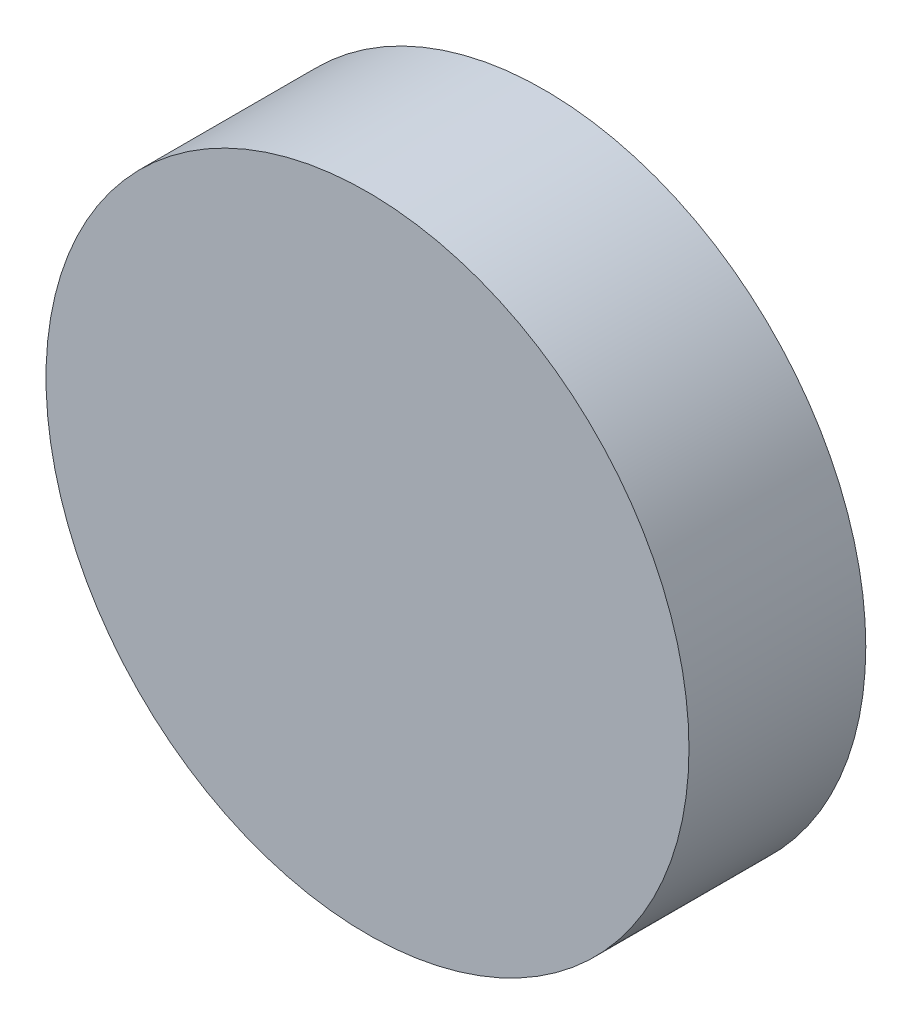
ISO-10303-21;
HEADER;
FILE_DESCRIPTION(('STEP AP214'),'2;1');
FILE_NAME('part.step','',(''),(''),'','','');
FILE_SCHEMA(('AUTOMOTIVE_DESIGN { 1 0 10303 214 1 1 1 1 }'));
ENDSEC;
DATA;
#1=APPLICATION_CONTEXT('core data for automotive mechanical design processes');
#2=APPLICATION_PROTOCOL_DEFINITION('international standard','automotive_design',2000,#1);
#3=PRODUCT_CONTEXT('',#1,'mechanical');
#4=PRODUCT('Part','Part','',(#3));
#5=PRODUCT_RELATED_PRODUCT_CATEGORY('part','',(#4));
#6=PRODUCT_DEFINITION_FORMATION('','',#4);
#7=PRODUCT_DEFINITION_CONTEXT('part definition',#1,'design');
#8=PRODUCT_DEFINITION('design','',#6,#7);
#9=PRODUCT_DEFINITION_SHAPE('','',#8);
#10=(LENGTH_UNIT() NAMED_UNIT(*) SI_UNIT(.MILLI.,.METRE.));
#11=(NAMED_UNIT(*) PLANE_ANGLE_UNIT() SI_UNIT($,.RADIAN.));
#12=(NAMED_UNIT(*) SI_UNIT($,.STERADIAN.) SOLID_ANGLE_UNIT());
#13=UNCERTAINTY_MEASURE_WITH_UNIT(LENGTH_MEASURE(1.E-05),#10,'distance_accuracy_value','');
#14=(GEOMETRIC_REPRESENTATION_CONTEXT(3) GLOBAL_UNCERTAINTY_ASSIGNED_CONTEXT((#13)) GLOBAL_UNIT_ASSIGNED_CONTEXT((#10,
#11,#12)) REPRESENTATION_CONTEXT('',''));
#15=CARTESIAN_POINT('',(0.,0.,0.));
#16=DIRECTION('',(0.,0.,1.));
#17=DIRECTION('',(1.,0.,0.));
#18=AXIS2_PLACEMENT_3D('',#15,#16,#17);
#19=CARTESIAN_POINT('',(860.,225.,822.));
#20=DIRECTION('',(0.,0.,-1.));
#21=DIRECTION('',(-1.,0.,0.));
#22=AXIS2_PLACEMENT_3D('',#19,#20,#21);
#23=CYLINDRICAL_SURFACE('',#22,40.);
#24=CARTESIAN_POINT('',(860.,225.,822.));
#25=DIRECTION('',(0.,0.,1.));
#26=DIRECTION('',(1.,0.,0.));
#27=AXIS2_PLACEMENT_3D('',#24,#25,#26);
#28=CIRCLE('',#27,40.);
#29=CARTESIAN_POINT('',(900.,225.,822.));
#30=VERTEX_POINT('',#29);
#31=EDGE_CURVE('E10',#30,#30,#28,.T.);
#32=ORIENTED_EDGE('',*,*,#31,.F.);
#33=EDGE_LOOP('',(#32));
#34=FACE_BOUND('',#33,.T.);
#35=CARTESIAN_POINT('',(860.,225.,800.));
#36=DIRECTION('',(0.,0.,1.));
#37=DIRECTION('',(1.,0.,0.));
#38=AXIS2_PLACEMENT_3D('',#35,#36,#37);
#39=CIRCLE('',#38,40.);
#40=CARTESIAN_POINT('',(900.,225.,800.));
#41=VERTEX_POINT('',#40);
#42=EDGE_CURVE('E45',#41,#41,#39,.T.);
#43=ORIENTED_EDGE('',*,*,#42,.T.);
#44=EDGE_LOOP('',(#43));
#45=FACE_BOUND('',#44,.T.);
#46=ADVANCED_FACE('F39',(#34,#45),#23,.T.);
#47=CARTESIAN_POINT('',(860.,225.,822.));
#48=DIRECTION('',(0.,0.,1.));
#49=DIRECTION('',(1.,0.,0.));
#50=AXIS2_PLACEMENT_3D('',#47,#48,#49);
#51=PLANE('',#50);
#52=ORIENTED_EDGE('',*,*,#31,.T.);
#53=EDGE_LOOP('',(#52));
#54=FACE_BOUND('',#53,.T.);
#55=ADVANCED_FACE('F53',(#54),#51,.T.);
#56=CARTESIAN_POINT('',(860.,225.,800.));
#57=DIRECTION('',(0.,0.,1.));
#58=DIRECTION('',(1.,0.,0.));
#59=AXIS2_PLACEMENT_3D('',#56,#57,#58);
#60=PLANE('',#59);
#61=ORIENTED_EDGE('',*,*,#42,.F.);
#62=EDGE_LOOP('',(#61));
#63=FACE_BOUND('',#62,.T.);
#64=ADVANCED_FACE('F55',(#63),#60,.F.);
#65=CLOSED_SHELL('',(#46,#55,#64));
#66=MANIFOLD_SOLID_BREP('B2',#65);
#67=ADVANCED_BREP_SHAPE_REPRESENTATION('',(#18,#66),#14);
#68=SHAPE_DEFINITION_REPRESENTATION(#9,#67);
ENDSEC;
END-ISO-10303-21;
